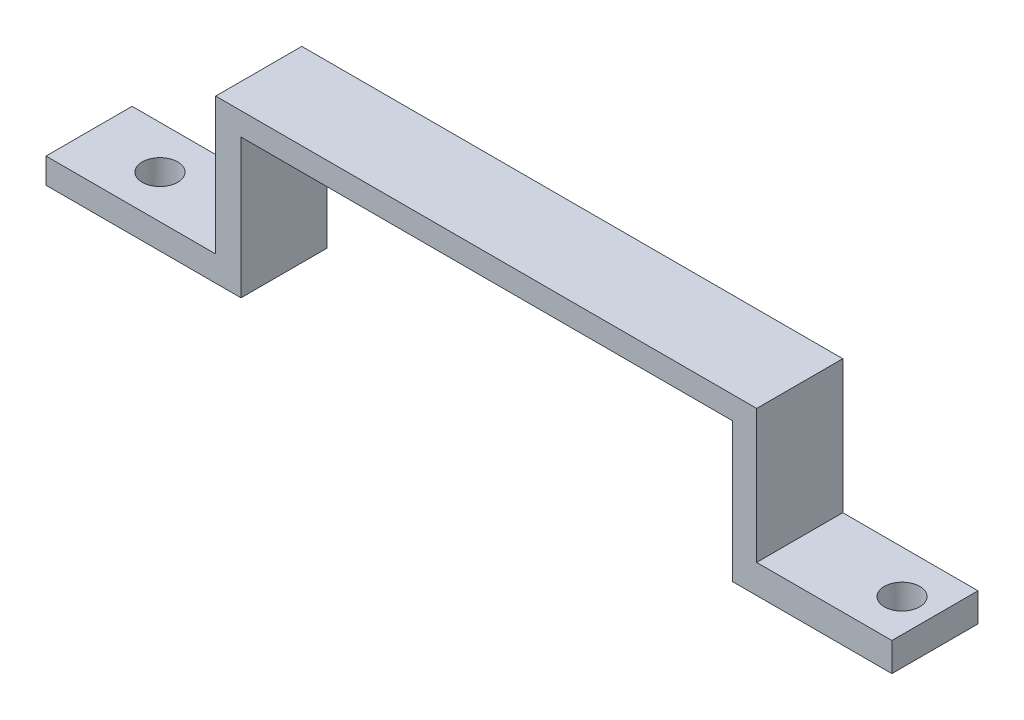
ISO-10303-21;
HEADER;
FILE_DESCRIPTION(('STEP AP214'),'2;1');
FILE_NAME('part.step','',(''),(''),'','','');
FILE_SCHEMA(('AUTOMOTIVE_DESIGN { 1 0 10303 214 1 1 1 1 }'));
ENDSEC;
DATA;
#1=APPLICATION_CONTEXT('core data for automotive mechanical design processes');
#2=APPLICATION_PROTOCOL_DEFINITION('international standard','automotive_design',2000,#1);
#3=PRODUCT_CONTEXT('',#1,'mechanical');
#4=PRODUCT('Part','Part','',(#3));
#5=PRODUCT_RELATED_PRODUCT_CATEGORY('part','',(#4));
#6=PRODUCT_DEFINITION_FORMATION('','',#4);
#7=PRODUCT_DEFINITION_CONTEXT('part definition',#1,'design');
#8=PRODUCT_DEFINITION('design','',#6,#7);
#9=PRODUCT_DEFINITION_SHAPE('','',#8);
#10=(LENGTH_UNIT() NAMED_UNIT(*) SI_UNIT(.MILLI.,.METRE.));
#11=(NAMED_UNIT(*) PLANE_ANGLE_UNIT() SI_UNIT($,.RADIAN.));
#12=(NAMED_UNIT(*) SI_UNIT($,.STERADIAN.) SOLID_ANGLE_UNIT());
#13=UNCERTAINTY_MEASURE_WITH_UNIT(LENGTH_MEASURE(1.E-05),#10,'distance_accuracy_value','');
#14=(GEOMETRIC_REPRESENTATION_CONTEXT(3) GLOBAL_UNCERTAINTY_ASSIGNED_CONTEXT((#13)) GLOBAL_UNIT_ASSIGNED_CONTEXT((#10,
#11,#12)) REPRESENTATION_CONTEXT('',''));
#15=CARTESIAN_POINT('',(0.,0.,0.));
#16=DIRECTION('',(0.,0.,1.));
#17=DIRECTION('',(1.,0.,0.));
#18=AXIS2_PLACEMENT_3D('',#15,#16,#17);
#19=CARTESIAN_POINT('',(0.,0.,0.));
#20=DIRECTION('',(0.,1.,0.));
#21=DIRECTION('',(0.,0.,1.));
#22=AXIS2_PLACEMENT_3D('',#19,#20,#21);
#23=PLANE('',#22);
#24=CARTESIAN_POINT('',(-125.372639057722,0.,-55.6637263591618));
#25=DIRECTION('',(0.,1.,0.));
#26=DIRECTION('',(0.,0.,1.));
#27=AXIS2_PLACEMENT_3D('',#24,#25,#26);
#28=CIRCLE('',#27,1.77800000000001);
#29=CARTESIAN_POINT('',(-125.372639057722,0.,-53.8857263591618));
#30=VERTEX_POINT('',#29);
#31=EDGE_CURVE('E167',#30,#30,#28,.T.);
#32=ORIENTED_EDGE('',*,*,#31,.T.);
#33=EDGE_LOOP('',(#32));
#34=FACE_BOUND('',#33,.T.);
#35=DIRECTION('',(-1.,0.,0.));
#36=VECTOR('',#35,1.);
#37=CARTESIAN_POINT('',(-132.484639057722,0.,-59.9817263591618));
#38=LINE('',#37,#36);
#39=CARTESIAN_POINT('',(-112.926639057722,0.,-59.9817263591618));
#40=VERTEX_POINT('',#39);
#41=CARTESIAN_POINT('',(-132.484639057722,0.,-59.9817263591618));
#42=VERTEX_POINT('',#41);
#43=EDGE_CURVE('E215',#40,#42,#38,.T.);
#44=ORIENTED_EDGE('',*,*,#43,.F.);
#45=DIRECTION('',(0.,0.,1.));
#46=VECTOR('',#45,1.);
#47=CARTESIAN_POINT('',(-112.926639057722,0.,-59.9817263591618));
#48=LINE('',#47,#46);
#49=CARTESIAN_POINT('',(-112.926639057722,0.,-51.3457263591618));
#50=VERTEX_POINT('',#49);
#51=EDGE_CURVE('E184',#40,#50,#48,.T.);
#52=ORIENTED_EDGE('',*,*,#51,.T.);
#53=DIRECTION('',(1.,0.,0.));
#54=VECTOR('',#53,1.);
#55=CARTESIAN_POINT('',(-132.484639057722,0.,-51.3457263591618));
#56=LINE('',#55,#54);
#57=CARTESIAN_POINT('',(-132.484639057722,0.,-51.3457263591618));
#58=VERTEX_POINT('',#57);
#59=EDGE_CURVE('E209',#58,#50,#56,.T.);
#60=ORIENTED_EDGE('',*,*,#59,.F.);
#61=DIRECTION('',(0.,0.,1.));
#62=VECTOR('',#61,1.);
#63=CARTESIAN_POINT('',(-132.484639057722,0.,-59.9817263591618));
#64=LINE('',#63,#62);
#65=EDGE_CURVE('E193',#42,#58,#64,.T.);
#66=ORIENTED_EDGE('',*,*,#65,.F.);
#67=EDGE_LOOP('',(#44,#52,#60,#66));
#68=FACE_BOUND('',#67,.T.);
#69=ADVANCED_FACE('F33',(#34,#68),#23,.F.);
#70=CARTESIAN_POINT('',(-132.484639057722,16.256,-59.9817263591618));
#71=DIRECTION('',(1.,0.,0.));
#72=DIRECTION('',(0.,0.,-1.));
#73=AXIS2_PLACEMENT_3D('',#70,#71,#72);
#74=PLANE('',#73);
#75=DIRECTION('',(0.,-1.,0.));
#76=VECTOR('',#75,1.);
#77=CARTESIAN_POINT('',(-132.484639057722,16.256,-51.3457263591618));
#78=LINE('',#77,#76);
#79=CARTESIAN_POINT('',(-132.484639057722,2.54,-51.3457263591618));
#80=VERTEX_POINT('',#79);
#81=EDGE_CURVE('E11',#80,#58,#78,.T.);
#82=ORIENTED_EDGE('',*,*,#81,.F.);
#83=DIRECTION('',(0.,0.,1.));
#84=VECTOR('',#83,1.);
#85=CARTESIAN_POINT('',(-132.484639057722,2.54,-59.9817263591618));
#86=LINE('',#85,#84);
#87=CARTESIAN_POINT('',(-132.484639057722,2.54,-59.9817263591618));
#88=VERTEX_POINT('',#87);
#89=EDGE_CURVE('E156',#88,#80,#86,.T.);
#90=ORIENTED_EDGE('',*,*,#89,.F.);
#91=DIRECTION('',(0.,-1.,0.));
#92=VECTOR('',#91,1.);
#93=CARTESIAN_POINT('',(-132.484639057722,16.256,-59.9817263591618));
#94=LINE('',#93,#92);
#95=EDGE_CURVE('E205',#88,#42,#94,.T.);
#96=ORIENTED_EDGE('',*,*,#95,.T.);
#97=ORIENTED_EDGE('',*,*,#65,.T.);
#98=EDGE_LOOP('',(#82,#90,#96,#97));
#99=FACE_BOUND('',#98,.T.);
#100=ADVANCED_FACE('F35',(#99),#74,.F.);
#101=CARTESIAN_POINT('',(-132.484639057722,16.256,-51.3457263591618));
#102=DIRECTION('',(0.,0.,-1.));
#103=DIRECTION('',(-1.,0.,0.));
#104=AXIS2_PLACEMENT_3D('',#101,#102,#103);
#105=PLANE('',#104);
#106=DIRECTION('',(0.,-1.,0.));
#107=VECTOR('',#106,1.);
#108=CARTESIAN_POINT('',(-47.6486390577225,16.256,-51.3457263591618));
#109=LINE('',#108,#107);
#110=CARTESIAN_POINT('',(-47.6486390577225,2.87970753726086,-51.3457263591618));
#111=VERTEX_POINT('',#110);
#112=CARTESIAN_POINT('',(-47.6486390577225,0.,-51.3457263591618));
#113=VERTEX_POINT('',#112);
#114=EDGE_CURVE('E42',#111,#113,#109,.T.);
#115=ORIENTED_EDGE('',*,*,#114,.F.);
#116=DIRECTION('',(1.,0.,0.));
#117=VECTOR('',#116,1.);
#118=CARTESIAN_POINT('',(-47.6486390577225,2.87970753726086,-51.3457263591618));
#119=LINE('',#118,#117);
#120=CARTESIAN_POINT('',(-61.2103998295197,2.87970753726086,-51.3457263591618));
#121=VERTEX_POINT('',#120);
#122=EDGE_CURVE('E144',#121,#111,#119,.T.);
#123=ORIENTED_EDGE('',*,*,#122,.F.);
#124=DIRECTION('',(0.,-1.,0.));
#125=VECTOR('',#124,1.);
#126=CARTESIAN_POINT('',(-61.2103998295197,16.256,-51.3457263591618));
#127=LINE('',#126,#125);
#128=CARTESIAN_POINT('',(-61.2103998295197,16.256,-51.3457263591618));
#129=VERTEX_POINT('',#128);
#130=EDGE_CURVE('E126',#129,#121,#127,.T.);
#131=ORIENTED_EDGE('',*,*,#130,.F.);
#132=DIRECTION('',(1.,0.,0.));
#133=VECTOR('',#132,1.);
#134=CARTESIAN_POINT('',(-132.484639057722,16.256,-51.3457263591618));
#135=LINE('',#134,#133);
#136=CARTESIAN_POINT('',(-115.466639057722,16.256,-51.3457263591618));
#137=VERTEX_POINT('',#136);
#138=EDGE_CURVE('E200',#137,#129,#135,.T.);
#139=ORIENTED_EDGE('',*,*,#138,.F.);
#140=DIRECTION('',(0.,1.,0.));
#141=VECTOR('',#140,1.);
#142=CARTESIAN_POINT('',(-115.466639057722,16.256,-51.3457263591618));
#143=LINE('',#142,#141);
#144=CARTESIAN_POINT('',(-115.466639057722,2.54,-51.3457263591618));
#145=VERTEX_POINT('',#144);
#146=EDGE_CURVE('E58',#145,#137,#143,.T.);
#147=ORIENTED_EDGE('',*,*,#146,.F.);
#148=DIRECTION('',(1.,0.,0.));
#149=VECTOR('',#148,1.);
#150=CARTESIAN_POINT('',(-132.484639057722,2.54,-51.3457263591618));
#151=LINE('',#150,#149);
#152=EDGE_CURVE('E157',#80,#145,#151,.T.);
#153=ORIENTED_EDGE('',*,*,#152,.F.);
#154=ORIENTED_EDGE('',*,*,#81,.T.);
#155=ORIENTED_EDGE('',*,*,#59,.T.);
#156=DIRECTION('',(0.,-1.,0.));
#157=VECTOR('',#156,1.);
#158=CARTESIAN_POINT('',(-112.926639057722,0.,-51.3457263591618));
#159=LINE('',#158,#157);
#160=CARTESIAN_POINT('',(-112.926639057722,13.97,-51.3457263591618));
#161=VERTEX_POINT('',#160);
#162=EDGE_CURVE('E173',#161,#50,#159,.T.);
#163=ORIENTED_EDGE('',*,*,#162,.F.);
#164=DIRECTION('',(-1.,0.,0.));
#165=VECTOR('',#164,1.);
#166=CARTESIAN_POINT('',(-112.926639057722,13.97,-51.3457263591618));
#167=LINE('',#166,#165);
#168=CARTESIAN_POINT('',(-63.6506390577225,13.97,-51.3457263591618));
#169=VERTEX_POINT('',#168);
#170=EDGE_CURVE('E178',#169,#161,#167,.T.);
#171=ORIENTED_EDGE('',*,*,#170,.F.);
#172=DIRECTION('',(0.,1.,0.));
#173=VECTOR('',#172,1.);
#174=CARTESIAN_POINT('',(-63.6506390577225,0.,-51.3457263591618));
#175=LINE('',#174,#173);
#176=CARTESIAN_POINT('',(-63.6506390577225,0.,-51.3457263591618));
#177=VERTEX_POINT('',#176);
#178=EDGE_CURVE('E186',#177,#169,#175,.T.);
#179=ORIENTED_EDGE('',*,*,#178,.F.);
#180=EDGE_CURVE('E208',#177,#113,#56,.T.);
#181=ORIENTED_EDGE('',*,*,#180,.T.);
#182=EDGE_LOOP('',(#115,#123,#131,#139,#147,#153,#154,#155,#163,#171,#179,#181));
#183=FACE_BOUND('',#182,.T.);
#184=ADVANCED_FACE('F246',(#183),#105,.F.);
#185=CARTESIAN_POINT('',(-47.6486390577225,16.256,-59.9817263591618));
#186=DIRECTION('',(-1.,0.,0.));
#187=DIRECTION('',(0.,0.,1.));
#188=AXIS2_PLACEMENT_3D('',#185,#186,#187);
#189=PLANE('',#188);
#190=DIRECTION('',(0.,-1.,0.));
#191=VECTOR('',#190,1.);
#192=CARTESIAN_POINT('',(-47.6486390577225,16.256,-59.9817263591618));
#193=LINE('',#192,#191);
#194=CARTESIAN_POINT('',(-47.6486390577225,2.87970753726086,-59.9817263591618));
#195=VERTEX_POINT('',#194);
#196=CARTESIAN_POINT('',(-47.6486390577225,0.,-59.9817263591618));
#197=VERTEX_POINT('',#196);
#198=EDGE_CURVE('E219',#195,#197,#193,.T.);
#199=ORIENTED_EDGE('',*,*,#198,.F.);
#200=DIRECTION('',(0.,0.,1.));
#201=VECTOR('',#200,1.);
#202=CARTESIAN_POINT('',(-47.6486390577225,2.87970753726086,-59.9817263591618));
#203=LINE('',#202,#201);
#204=EDGE_CURVE('E129',#195,#111,#203,.T.);
#205=ORIENTED_EDGE('',*,*,#204,.T.);
#206=ORIENTED_EDGE('',*,*,#114,.T.);
#207=DIRECTION('',(0.,0.,-1.));
#208=VECTOR('',#207,1.);
#209=CARTESIAN_POINT('',(-47.6486390577225,0.,-59.9817263591618));
#210=LINE('',#209,#208);
#211=EDGE_CURVE('E212',#113,#197,#210,.T.);
#212=ORIENTED_EDGE('',*,*,#211,.T.);
#213=EDGE_LOOP('',(#199,#205,#206,#212));
#214=FACE_BOUND('',#213,.T.);
#215=ADVANCED_FACE('F279',(#214),#189,.F.);
#216=CARTESIAN_POINT('',(-132.484639057722,16.256,-59.9817263591618));
#217=DIRECTION('',(0.,0.,1.));
#218=DIRECTION('',(1.,0.,0.));
#219=AXIS2_PLACEMENT_3D('',#216,#217,#218);
#220=PLANE('',#219);
#221=DIRECTION('',(0.,-1.,0.));
#222=VECTOR('',#221,1.);
#223=CARTESIAN_POINT('',(-61.2103998295197,16.256,-59.9817263591618));
#224=LINE('',#223,#222);
#225=CARTESIAN_POINT('',(-61.2103998295197,16.256,-59.9817263591618));
#226=VERTEX_POINT('',#225);
#227=CARTESIAN_POINT('',(-61.2103998295197,2.87970753726086,-59.9817263591618));
#228=VERTEX_POINT('',#227);
#229=EDGE_CURVE('E50',#226,#228,#224,.T.);
#230=ORIENTED_EDGE('',*,*,#229,.T.);
#231=DIRECTION('',(1.,0.,0.));
#232=VECTOR('',#231,1.);
#233=CARTESIAN_POINT('',(-47.6486390577225,2.87970753726086,-59.9817263591618));
#234=LINE('',#233,#232);
#235=EDGE_CURVE('E133',#228,#195,#234,.T.);
#236=ORIENTED_EDGE('',*,*,#235,.T.);
#237=ORIENTED_EDGE('',*,*,#198,.T.);
#238=CARTESIAN_POINT('',(-63.6506390577225,0.,-59.9817263591618));
#239=VERTEX_POINT('',#238);
#240=EDGE_CURVE('E203',#197,#239,#38,.T.);
#241=ORIENTED_EDGE('',*,*,#240,.T.);
#242=DIRECTION('',(0.,1.,0.));
#243=VECTOR('',#242,1.);
#244=CARTESIAN_POINT('',(-63.6506390577225,0.,-59.9817263591618));
#245=LINE('',#244,#243);
#246=CARTESIAN_POINT('',(-63.6506390577225,13.97,-59.9817263591618));
#247=VERTEX_POINT('',#246);
#248=EDGE_CURVE('E177',#239,#247,#245,.T.);
#249=ORIENTED_EDGE('',*,*,#248,.T.);
#250=DIRECTION('',(-1.,0.,0.));
#251=VECTOR('',#250,1.);
#252=CARTESIAN_POINT('',(-112.926639057722,13.97,-59.9817263591618));
#253=LINE('',#252,#251);
#254=CARTESIAN_POINT('',(-112.926639057722,13.97,-59.9817263591618));
#255=VERTEX_POINT('',#254);
#256=EDGE_CURVE('E181',#247,#255,#253,.T.);
#257=ORIENTED_EDGE('',*,*,#256,.T.);
#258=DIRECTION('',(0.,-1.,0.));
#259=VECTOR('',#258,1.);
#260=CARTESIAN_POINT('',(-112.926639057722,0.,-59.9817263591618));
#261=LINE('',#260,#259);
#262=EDGE_CURVE('E174',#255,#40,#261,.T.);
#263=ORIENTED_EDGE('',*,*,#262,.T.);
#264=ORIENTED_EDGE('',*,*,#43,.T.);
#265=ORIENTED_EDGE('',*,*,#95,.F.);
#266=DIRECTION('',(1.,0.,0.));
#267=VECTOR('',#266,1.);
#268=CARTESIAN_POINT('',(-132.484639057722,2.54,-59.9817263591618));
#269=LINE('',#268,#267);
#270=CARTESIAN_POINT('',(-115.466639057722,2.54,-59.9817263591618));
#271=VERTEX_POINT('',#270);
#272=EDGE_CURVE('E151',#88,#271,#269,.T.);
#273=ORIENTED_EDGE('',*,*,#272,.T.);
#274=DIRECTION('',(0.,1.,0.));
#275=VECTOR('',#274,1.);
#276=CARTESIAN_POINT('',(-115.466639057722,16.256,-59.9817263591618));
#277=LINE('',#276,#275);
#278=CARTESIAN_POINT('',(-115.466639057722,16.256,-59.9817263591618));
#279=VERTEX_POINT('',#278);
#280=EDGE_CURVE('E154',#271,#279,#277,.T.);
#281=ORIENTED_EDGE('',*,*,#280,.T.);
#282=DIRECTION('',(-1.,0.,0.));
#283=VECTOR('',#282,1.);
#284=CARTESIAN_POINT('',(-132.484639057722,16.256,-59.9817263591618));
#285=LINE('',#284,#283);
#286=EDGE_CURVE('E143',#226,#279,#285,.T.);
#287=ORIENTED_EDGE('',*,*,#286,.F.);
#288=EDGE_LOOP('',(#230,#236,#237,#241,#249,#257,#263,#264,#265,#273,#281,#287));
#289=FACE_BOUND('',#288,.T.);
#290=ADVANCED_FACE('F141',(#289),#220,.F.);
#291=CARTESIAN_POINT('',(0.,16.256,0.));
#292=DIRECTION('',(0.,1.,0.));
#293=DIRECTION('',(0.,0.,1.));
#294=AXIS2_PLACEMENT_3D('',#291,#292,#293);
#295=PLANE('',#294);
#296=DIRECTION('',(0.,0.,1.));
#297=VECTOR('',#296,1.);
#298=CARTESIAN_POINT('',(-61.2103998295197,16.256,-59.9817263591618));
#299=LINE('',#298,#297);
#300=EDGE_CURVE('E130',#226,#129,#299,.T.);
#301=ORIENTED_EDGE('',*,*,#300,.F.);
#302=ORIENTED_EDGE('',*,*,#286,.T.);
#303=DIRECTION('',(0.,0.,1.));
#304=VECTOR('',#303,1.);
#305=CARTESIAN_POINT('',(-115.466639057722,16.256,-59.9817263591618));
#306=LINE('',#305,#304);
#307=EDGE_CURVE('E161',#279,#137,#306,.T.);
#308=ORIENTED_EDGE('',*,*,#307,.T.);
#309=ORIENTED_EDGE('',*,*,#138,.T.);
#310=EDGE_LOOP('',(#301,#302,#308,#309));
#311=FACE_BOUND('',#310,.T.);
#312=ADVANCED_FACE('F253',(#311),#295,.T.);
#313=CARTESIAN_POINT('',(-50.9506390577225,0.,-55.6637263591618));
#314=DIRECTION('',(0.,1.,0.));
#315=DIRECTION('',(0.,0.,1.));
#316=AXIS2_PLACEMENT_3D('',#313,#314,#315);
#317=CIRCLE('',#316,1.778);
#318=CARTESIAN_POINT('',(-50.9506390577225,0.,-53.8857263591618));
#319=VERTEX_POINT('',#318);
#320=EDGE_CURVE('E170',#319,#319,#317,.T.);
#321=ORIENTED_EDGE('',*,*,#320,.T.);
#322=EDGE_LOOP('',(#321));
#323=FACE_BOUND('',#322,.T.);
#324=ORIENTED_EDGE('',*,*,#180,.F.);
#325=DIRECTION('',(0.,0.,1.));
#326=VECTOR('',#325,1.);
#327=CARTESIAN_POINT('',(-63.6506390577225,0.,-59.9817263591618));
#328=LINE('',#327,#326);
#329=EDGE_CURVE('E196',#239,#177,#328,.T.);
#330=ORIENTED_EDGE('',*,*,#329,.F.);
#331=ORIENTED_EDGE('',*,*,#240,.F.);
#332=ORIENTED_EDGE('',*,*,#211,.F.);
#333=EDGE_LOOP('',(#324,#330,#331,#332));
#334=FACE_BOUND('',#333,.T.);
#335=ADVANCED_FACE('F242',(#323,#334),#23,.F.);
#336=CARTESIAN_POINT('',(-112.926639057722,0.,-59.9817263591618));
#337=DIRECTION('',(-1.,0.,0.));
#338=DIRECTION('',(0.,0.,1.));
#339=AXIS2_PLACEMENT_3D('',#336,#337,#338);
#340=PLANE('',#339);
#341=ORIENTED_EDGE('',*,*,#162,.T.);
#342=ORIENTED_EDGE('',*,*,#51,.F.);
#343=ORIENTED_EDGE('',*,*,#262,.F.);
#344=DIRECTION('',(0.,0.,1.));
#345=VECTOR('',#344,1.);
#346=CARTESIAN_POINT('',(-112.926639057722,13.97,-59.9817263591618));
#347=LINE('',#346,#345);
#348=EDGE_CURVE('E191',#255,#161,#347,.T.);
#349=ORIENTED_EDGE('',*,*,#348,.T.);
#350=EDGE_LOOP('',(#341,#342,#343,#349));
#351=FACE_BOUND('',#350,.T.);
#352=ADVANCED_FACE('F252',(#351),#340,.F.);
#353=CARTESIAN_POINT('',(-112.926639057722,13.97,-59.9817263591618));
#354=DIRECTION('',(0.,1.,0.));
#355=DIRECTION('',(0.,0.,1.));
#356=AXIS2_PLACEMENT_3D('',#353,#354,#355);
#357=PLANE('',#356);
#358=ORIENTED_EDGE('',*,*,#170,.T.);
#359=ORIENTED_EDGE('',*,*,#348,.F.);
#360=ORIENTED_EDGE('',*,*,#256,.F.);
#361=DIRECTION('',(0.,0.,1.));
#362=VECTOR('',#361,1.);
#363=CARTESIAN_POINT('',(-63.6506390577225,13.97,-59.9817263591618));
#364=LINE('',#363,#362);
#365=EDGE_CURVE('E194',#247,#169,#364,.T.);
#366=ORIENTED_EDGE('',*,*,#365,.T.);
#367=EDGE_LOOP('',(#358,#359,#360,#366));
#368=FACE_BOUND('',#367,.T.);
#369=ADVANCED_FACE('F259',(#368),#357,.F.);
#370=CARTESIAN_POINT('',(-63.6506390577225,0.,-59.9817263591618));
#371=DIRECTION('',(1.,0.,0.));
#372=DIRECTION('',(0.,0.,-1.));
#373=AXIS2_PLACEMENT_3D('',#370,#371,#372);
#374=PLANE('',#373);
#375=ORIENTED_EDGE('',*,*,#178,.T.);
#376=ORIENTED_EDGE('',*,*,#365,.F.);
#377=ORIENTED_EDGE('',*,*,#248,.F.);
#378=ORIENTED_EDGE('',*,*,#329,.T.);
#379=EDGE_LOOP('',(#375,#376,#377,#378));
#380=FACE_BOUND('',#379,.T.);
#381=ADVANCED_FACE('F276',(#380),#374,.F.);
#382=CARTESIAN_POINT('',(-50.9506390577225,0.,-55.6637263591618));
#383=DIRECTION('',(0.,1.,0.));
#384=DIRECTION('',(0.,0.,1.));
#385=AXIS2_PLACEMENT_3D('',#382,#383,#384);
#386=CYLINDRICAL_SURFACE('',#385,1.778);
#387=CARTESIAN_POINT('',(-50.9506390577225,2.87970753726086,-55.6637263591618));
#388=DIRECTION('',(0.,-1.,0.));
#389=DIRECTION('',(0.,0.,-1.));
#390=AXIS2_PLACEMENT_3D('',#387,#388,#389);
#391=CIRCLE('',#390,1.778);
#392=CARTESIAN_POINT('',(-50.9506390577225,2.87970753726086,-57.4417263591618));
#393=VERTEX_POINT('',#392);
#394=EDGE_CURVE('E37',#393,#393,#391,.F.);
#395=ORIENTED_EDGE('',*,*,#394,.T.);
#396=EDGE_LOOP('',(#395));
#397=FACE_BOUND('',#396,.T.);
#398=ORIENTED_EDGE('',*,*,#320,.F.);
#399=EDGE_LOOP('',(#398));
#400=FACE_BOUND('',#399,.T.);
#401=ADVANCED_FACE('F237',(#397,#400),#386,.F.);
#402=CARTESIAN_POINT('',(-125.372639057722,0.,-55.6637263591618));
#403=DIRECTION('',(0.,1.,0.));
#404=DIRECTION('',(0.,0.,1.));
#405=AXIS2_PLACEMENT_3D('',#402,#403,#404);
#406=CYLINDRICAL_SURFACE('',#405,1.77800000000001);
#407=CARTESIAN_POINT('',(-125.372639057722,2.54,-55.6637263591618));
#408=DIRECTION('',(0.,-1.,0.));
#409=DIRECTION('',(1.,0.,0.));
#410=AXIS2_PLACEMENT_3D('',#407,#408,#409);
#411=CIRCLE('',#410,1.77800000000001);
#412=CARTESIAN_POINT('',(-123.594639057722,2.54,-55.6637263591618));
#413=VERTEX_POINT('',#412);
#414=EDGE_CURVE('E163',#413,#413,#411,.F.);
#415=ORIENTED_EDGE('',*,*,#414,.T.);
#416=EDGE_LOOP('',(#415));
#417=FACE_BOUND('',#416,.T.);
#418=ORIENTED_EDGE('',*,*,#31,.F.);
#419=EDGE_LOOP('',(#418));
#420=FACE_BOUND('',#419,.T.);
#421=ADVANCED_FACE('F224',(#417,#420),#406,.F.);
#422=CARTESIAN_POINT('',(-132.484639057722,2.54,-59.9817263591618));
#423=DIRECTION('',(0.,-1.,0.));
#424=DIRECTION('',(1.,0.,0.));
#425=AXIS2_PLACEMENT_3D('',#422,#423,#424);
#426=PLANE('',#425);
#427=ORIENTED_EDGE('',*,*,#152,.T.);
#428=DIRECTION('',(0.,0.,1.));
#429=VECTOR('',#428,1.);
#430=CARTESIAN_POINT('',(-115.466639057722,2.54,-59.9817263591618));
#431=LINE('',#430,#429);
#432=EDGE_CURVE('E164',#271,#145,#431,.T.);
#433=ORIENTED_EDGE('',*,*,#432,.F.);
#434=ORIENTED_EDGE('',*,*,#272,.F.);
#435=ORIENTED_EDGE('',*,*,#89,.T.);
#436=EDGE_LOOP('',(#427,#433,#434,#435));
#437=FACE_BOUND('',#436,.T.);
#438=ORIENTED_EDGE('',*,*,#414,.F.);
#439=EDGE_LOOP('',(#438));
#440=FACE_BOUND('',#439,.T.);
#441=ADVANCED_FACE('F227',(#437,#440),#426,.F.);
#442=CARTESIAN_POINT('',(-115.466639057722,16.256,-59.9817263591618));
#443=DIRECTION('',(1.,0.,0.));
#444=DIRECTION('',(0.,0.,-1.));
#445=AXIS2_PLACEMENT_3D('',#442,#443,#444);
#446=PLANE('',#445);
#447=ORIENTED_EDGE('',*,*,#146,.T.);
#448=ORIENTED_EDGE('',*,*,#307,.F.);
#449=ORIENTED_EDGE('',*,*,#280,.F.);
#450=ORIENTED_EDGE('',*,*,#432,.T.);
#451=EDGE_LOOP('',(#447,#448,#449,#450));
#452=FACE_BOUND('',#451,.T.);
#453=ADVANCED_FACE('F229',(#452),#446,.F.);
#454=CARTESIAN_POINT('',(-47.6486390577225,2.87970753726086,-59.9817263591618));
#455=DIRECTION('',(0.,-1.,0.));
#456=DIRECTION('',(0.,0.,-1.));
#457=AXIS2_PLACEMENT_3D('',#454,#455,#456);
#458=PLANE('',#457);
#459=ORIENTED_EDGE('',*,*,#122,.T.);
#460=ORIENTED_EDGE('',*,*,#204,.F.);
#461=ORIENTED_EDGE('',*,*,#235,.F.);
#462=DIRECTION('',(0.,0.,1.));
#463=VECTOR('',#462,1.);
#464=CARTESIAN_POINT('',(-61.2103998295197,2.87970753726086,-59.9817263591618));
#465=LINE('',#464,#463);
#466=EDGE_CURVE('E122',#228,#121,#465,.T.);
#467=ORIENTED_EDGE('',*,*,#466,.T.);
#468=EDGE_LOOP('',(#459,#460,#461,#467));
#469=FACE_BOUND('',#468,.T.);
#470=ORIENTED_EDGE('',*,*,#394,.F.);
#471=EDGE_LOOP('',(#470));
#472=FACE_BOUND('',#471,.T.);
#473=ADVANCED_FACE('F134',(#469,#472),#458,.F.);
#474=CARTESIAN_POINT('',(-61.2103998295197,16.256,-59.9817263591618));
#475=DIRECTION('',(-1.,0.,0.));
#476=DIRECTION('',(0.,0.,1.));
#477=AXIS2_PLACEMENT_3D('',#474,#475,#476);
#478=PLANE('',#477);
#479=ORIENTED_EDGE('',*,*,#130,.T.);
#480=ORIENTED_EDGE('',*,*,#466,.F.);
#481=ORIENTED_EDGE('',*,*,#229,.F.);
#482=ORIENTED_EDGE('',*,*,#300,.T.);
#483=EDGE_LOOP('',(#479,#480,#481,#482));
#484=FACE_BOUND('',#483,.T.);
#485=ADVANCED_FACE('F124',(#484),#478,.F.);
#486=CLOSED_SHELL('',(#69,#100,#184,#215,#290,#312,#335,#352,#369,#381,#401,#421,#441,#453,#473,#485));
#487=MANIFOLD_SOLID_BREP('B2',#486);
#488=ADVANCED_BREP_SHAPE_REPRESENTATION('',(#18,#487),#14);
#489=SHAPE_DEFINITION_REPRESENTATION(#9,#488);
ENDSEC;
END-ISO-10303-21;
